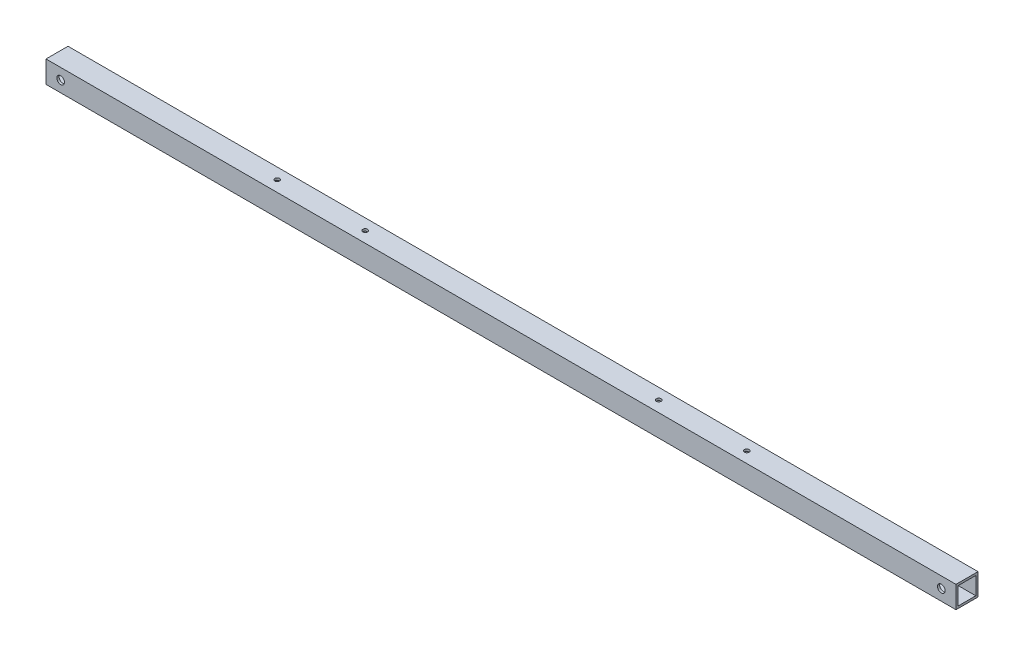
ISO-10303-21;
HEADER;
FILE_DESCRIPTION(('STEP AP214'),'2;1');
FILE_NAME('part.step','',(''),(''),'','','');
FILE_SCHEMA(('AUTOMOTIVE_DESIGN { 1 0 10303 214 1 1 1 1 }'));
ENDSEC;
DATA;
#1=APPLICATION_CONTEXT('core data for automotive mechanical design processes');
#2=APPLICATION_PROTOCOL_DEFINITION('international standard','automotive_design',2000,#1);
#3=PRODUCT_CONTEXT('',#1,'mechanical');
#4=PRODUCT('Part','Part','',(#3));
#5=PRODUCT_RELATED_PRODUCT_CATEGORY('part','',(#4));
#6=PRODUCT_DEFINITION_FORMATION('','',#4);
#7=PRODUCT_DEFINITION_CONTEXT('part definition',#1,'design');
#8=PRODUCT_DEFINITION('design','',#6,#7);
#9=PRODUCT_DEFINITION_SHAPE('','',#8);
#10=(LENGTH_UNIT() NAMED_UNIT(*) SI_UNIT(.MILLI.,.METRE.));
#11=(NAMED_UNIT(*) PLANE_ANGLE_UNIT() SI_UNIT($,.RADIAN.));
#12=(NAMED_UNIT(*) SI_UNIT($,.STERADIAN.) SOLID_ANGLE_UNIT());
#13=UNCERTAINTY_MEASURE_WITH_UNIT(LENGTH_MEASURE(1.E-05),#10,'distance_accuracy_value','');
#14=(GEOMETRIC_REPRESENTATION_CONTEXT(3) GLOBAL_UNCERTAINTY_ASSIGNED_CONTEXT((#13)) GLOBAL_UNIT_ASSIGNED_CONTEXT((#10,
#11,#12)) REPRESENTATION_CONTEXT('',''));
#15=CARTESIAN_POINT('',(0.,0.,0.));
#16=DIRECTION('',(0.,0.,1.));
#17=DIRECTION('',(1.,0.,0.));
#18=AXIS2_PLACEMENT_3D('',#15,#16,#17);
#19=CARTESIAN_POINT('',(10.,7.5,15.));
#20=DIRECTION('',(0.,0.,-1.));
#21=DIRECTION('',(-1.,0.,0.));
#22=AXIS2_PLACEMENT_3D('',#19,#20,#21);
#23=CYLINDRICAL_SURFACE('',#22,2.6);
#24=CARTESIAN_POINT('',(10.,7.5,13.5));
#25=DIRECTION('',(0.,0.,1.));
#26=DIRECTION('',(1.,0.,0.));
#27=AXIS2_PLACEMENT_3D('',#24,#25,#26);
#28=CIRCLE('',#27,2.6);
#29=CARTESIAN_POINT('',(12.6,7.5,13.5));
#30=VERTEX_POINT('',#29);
#31=EDGE_CURVE('E170',#30,#30,#28,.T.);
#32=ORIENTED_EDGE('',*,*,#31,.F.);
#33=EDGE_LOOP('',(#32));
#34=FACE_BOUND('',#33,.T.);
#35=CARTESIAN_POINT('',(10.,7.5,15.));
#36=DIRECTION('',(0.,0.,1.));
#37=DIRECTION('',(1.,0.,0.));
#38=AXIS2_PLACEMENT_3D('',#35,#36,#37);
#39=CIRCLE('',#38,2.6);
#40=CARTESIAN_POINT('',(12.6,7.5,15.));
#41=VERTEX_POINT('',#40);
#42=EDGE_CURVE('E183',#41,#41,#39,.T.);
#43=ORIENTED_EDGE('',*,*,#42,.T.);
#44=EDGE_LOOP('',(#43));
#45=FACE_BOUND('',#44,.T.);
#46=ADVANCED_FACE('F45',(#34,#45),#23,.F.);
#47=CARTESIAN_POINT('',(610.,7.5,15.));
#48=DIRECTION('',(0.,0.,-1.));
#49=DIRECTION('',(-1.,0.,0.));
#50=AXIS2_PLACEMENT_3D('',#47,#48,#49);
#51=CYLINDRICAL_SURFACE('',#50,2.60000000000007);
#52=CARTESIAN_POINT('',(610.,7.5,13.5));
#53=DIRECTION('',(0.,0.,1.));
#54=DIRECTION('',(1.,0.,0.));
#55=AXIS2_PLACEMENT_3D('',#52,#53,#54);
#56=CIRCLE('',#55,2.60000000000007);
#57=CARTESIAN_POINT('',(612.6,7.5,13.5));
#58=VERTEX_POINT('',#57);
#59=EDGE_CURVE('E169',#58,#58,#56,.T.);
#60=ORIENTED_EDGE('',*,*,#59,.F.);
#61=EDGE_LOOP('',(#60));
#62=FACE_BOUND('',#61,.T.);
#63=CARTESIAN_POINT('',(610.,7.5,15.));
#64=DIRECTION('',(0.,0.,1.));
#65=DIRECTION('',(1.,0.,0.));
#66=AXIS2_PLACEMENT_3D('',#63,#64,#65);
#67=CIRCLE('',#66,2.60000000000007);
#68=CARTESIAN_POINT('',(612.6,7.5,15.));
#69=VERTEX_POINT('',#68);
#70=EDGE_CURVE('E175',#69,#69,#67,.T.);
#71=ORIENTED_EDGE('',*,*,#70,.T.);
#72=EDGE_LOOP('',(#71));
#73=FACE_BOUND('',#72,.T.);
#74=ADVANCED_FACE('F322',(#62,#73),#51,.F.);
#75=CARTESIAN_POINT('',(0.,0.,15.));
#76=DIRECTION('',(0.,0.,-1.));
#77=DIRECTION('',(-1.,0.,0.));
#78=AXIS2_PLACEMENT_3D('',#75,#76,#77);
#79=PLANE('',#78);
#80=DIRECTION('',(0.,-1.,0.));
#81=VECTOR('',#80,1.);
#82=CARTESIAN_POINT('',(0.,0.,15.));
#83=LINE('',#82,#81);
#84=CARTESIAN_POINT('',(0.,15.,15.));
#85=VERTEX_POINT('',#84);
#86=CARTESIAN_POINT('',(0.,0.,15.));
#87=VERTEX_POINT('',#86);
#88=EDGE_CURVE('E191',#85,#87,#83,.T.);
#89=ORIENTED_EDGE('',*,*,#88,.T.);
#90=DIRECTION('',(1.,0.,0.));
#91=VECTOR('',#90,1.);
#92=CARTESIAN_POINT('',(0.,0.,15.));
#93=LINE('',#92,#91);
#94=CARTESIAN_POINT('',(620.,0.,15.));
#95=VERTEX_POINT('',#94);
#96=EDGE_CURVE('E195',#87,#95,#93,.T.);
#97=ORIENTED_EDGE('',*,*,#96,.T.);
#98=DIRECTION('',(0.,1.,0.));
#99=VECTOR('',#98,1.);
#100=CARTESIAN_POINT('',(620.,0.,15.));
#101=LINE('',#100,#99);
#102=CARTESIAN_POINT('',(620.,15.,15.));
#103=VERTEX_POINT('',#102);
#104=EDGE_CURVE('E199',#95,#103,#101,.T.);
#105=ORIENTED_EDGE('',*,*,#104,.T.);
#106=DIRECTION('',(-1.,0.,0.));
#107=VECTOR('',#106,1.);
#108=CARTESIAN_POINT('',(0.,15.,15.));
#109=LINE('',#108,#107);
#110=EDGE_CURVE('E202',#103,#85,#109,.T.);
#111=ORIENTED_EDGE('',*,*,#110,.T.);
#112=EDGE_LOOP('',(#89,#97,#105,#111));
#113=FACE_BOUND('',#112,.T.);
#114=ORIENTED_EDGE('',*,*,#42,.F.);
#115=EDGE_LOOP('',(#114));
#116=FACE_BOUND('',#115,.T.);
#117=ORIENTED_EDGE('',*,*,#70,.F.);
#118=EDGE_LOOP('',(#117));
#119=FACE_BOUND('',#118,.T.);
#120=ADVANCED_FACE('F330',(#113,#116,#119),#79,.F.);
#121=CARTESIAN_POINT('',(0.,0.,0.));
#122=DIRECTION('',(0.,0.,-1.));
#123=DIRECTION('',(-1.,0.,0.));
#124=AXIS2_PLACEMENT_3D('',#121,#122,#123);
#125=PLANE('',#124);
#126=CARTESIAN_POINT('',(10.,7.5,0.));
#127=DIRECTION('',(0.,0.,1.));
#128=DIRECTION('',(1.,0.,0.));
#129=AXIS2_PLACEMENT_3D('',#126,#127,#128);
#130=CIRCLE('',#129,2.6);
#131=CARTESIAN_POINT('',(12.6,7.5,0.));
#132=VERTEX_POINT('',#131);
#133=EDGE_CURVE('E179',#132,#132,#130,.T.);
#134=ORIENTED_EDGE('',*,*,#133,.T.);
#135=EDGE_LOOP('',(#134));
#136=FACE_BOUND('',#135,.T.);
#137=DIRECTION('',(0.,-1.,0.));
#138=VECTOR('',#137,1.);
#139=CARTESIAN_POINT('',(0.,0.,0.));
#140=LINE('',#139,#138);
#141=CARTESIAN_POINT('',(0.,15.,0.));
#142=VERTEX_POINT('',#141);
#143=CARTESIAN_POINT('',(0.,0.,0.));
#144=VERTEX_POINT('',#143);
#145=EDGE_CURVE('E187',#142,#144,#140,.T.);
#146=ORIENTED_EDGE('',*,*,#145,.F.);
#147=DIRECTION('',(-1.,0.,0.));
#148=VECTOR('',#147,1.);
#149=CARTESIAN_POINT('',(0.,15.,0.));
#150=LINE('',#149,#148);
#151=CARTESIAN_POINT('',(620.,15.,0.));
#152=VERTEX_POINT('',#151);
#153=EDGE_CURVE('E196',#152,#142,#150,.T.);
#154=ORIENTED_EDGE('',*,*,#153,.F.);
#155=DIRECTION('',(0.,1.,0.));
#156=VECTOR('',#155,1.);
#157=CARTESIAN_POINT('',(620.,0.,0.));
#158=LINE('',#157,#156);
#159=CARTESIAN_POINT('',(620.,0.,0.));
#160=VERTEX_POINT('',#159);
#161=EDGE_CURVE('E212',#160,#152,#158,.T.);
#162=ORIENTED_EDGE('',*,*,#161,.F.);
#163=DIRECTION('',(1.,0.,0.));
#164=VECTOR('',#163,1.);
#165=CARTESIAN_POINT('',(0.,0.,0.));
#166=LINE('',#165,#164);
#167=EDGE_CURVE('E209',#144,#160,#166,.T.);
#168=ORIENTED_EDGE('',*,*,#167,.F.);
#169=EDGE_LOOP('',(#146,#154,#162,#168));
#170=FACE_BOUND('',#169,.T.);
#171=CARTESIAN_POINT('',(610.,7.5,0.));
#172=DIRECTION('',(0.,0.,1.));
#173=DIRECTION('',(1.,0.,0.));
#174=AXIS2_PLACEMENT_3D('',#171,#172,#173);
#175=CIRCLE('',#174,2.60000000000007);
#176=CARTESIAN_POINT('',(612.6,7.5,0.));
#177=VERTEX_POINT('',#176);
#178=EDGE_CURVE('E174',#177,#177,#175,.T.);
#179=ORIENTED_EDGE('',*,*,#178,.T.);
#180=EDGE_LOOP('',(#179));
#181=FACE_BOUND('',#180,.T.);
#182=ADVANCED_FACE('F352',(#136,#170,#181),#125,.T.);
#183=CARTESIAN_POINT('',(0.,0.,15.));
#184=DIRECTION('',(1.,0.,0.));
#185=DIRECTION('',(0.,0.,-1.));
#186=AXIS2_PLACEMENT_3D('',#183,#184,#185);
#187=PLANE('',#186);
#188=DIRECTION('',(0.,-1.,0.));
#189=VECTOR('',#188,1.);
#190=CARTESIAN_POINT('',(0.,13.5,1.5));
#191=LINE('',#190,#189);
#192=CARTESIAN_POINT('',(0.,13.5,1.5));
#193=VERTEX_POINT('',#192);
#194=CARTESIAN_POINT('',(0.,1.5,1.5));
#195=VERTEX_POINT('',#194);
#196=EDGE_CURVE('E150',#193,#195,#191,.T.);
#197=ORIENTED_EDGE('',*,*,#196,.F.);
#198=DIRECTION('',(0.,0.,-1.));
#199=VECTOR('',#198,1.);
#200=CARTESIAN_POINT('',(0.,13.5,13.5));
#201=LINE('',#200,#199);
#202=CARTESIAN_POINT('',(0.,13.5,13.5));
#203=VERTEX_POINT('',#202);
#204=EDGE_CURVE('E63',#203,#193,#201,.T.);
#205=ORIENTED_EDGE('',*,*,#204,.F.);
#206=DIRECTION('',(0.,1.,0.));
#207=VECTOR('',#206,1.);
#208=CARTESIAN_POINT('',(0.,1.5,13.5));
#209=LINE('',#208,#207);
#210=CARTESIAN_POINT('',(0.,1.5,13.5));
#211=VERTEX_POINT('',#210);
#212=EDGE_CURVE('E134',#211,#203,#209,.T.);
#213=ORIENTED_EDGE('',*,*,#212,.F.);
#214=DIRECTION('',(0.,0.,1.));
#215=VECTOR('',#214,1.);
#216=CARTESIAN_POINT('',(0.,1.5,1.5));
#217=LINE('',#216,#215);
#218=EDGE_CURVE('E138',#195,#211,#217,.T.);
#219=ORIENTED_EDGE('',*,*,#218,.F.);
#220=EDGE_LOOP('',(#197,#205,#213,#219));
#221=FACE_BOUND('',#220,.T.);
#222=ORIENTED_EDGE('',*,*,#145,.T.);
#223=DIRECTION('',(0.,0.,-1.));
#224=VECTOR('',#223,1.);
#225=CARTESIAN_POINT('',(0.,0.,15.));
#226=LINE('',#225,#224);
#227=EDGE_CURVE('E11',#87,#144,#226,.T.);
#228=ORIENTED_EDGE('',*,*,#227,.F.);
#229=ORIENTED_EDGE('',*,*,#88,.F.);
#230=DIRECTION('',(0.,0.,-1.));
#231=VECTOR('',#230,1.);
#232=CARTESIAN_POINT('',(0.,15.,15.));
#233=LINE('',#232,#231);
#234=EDGE_CURVE('E205',#85,#142,#233,.T.);
#235=ORIENTED_EDGE('',*,*,#234,.T.);
#236=EDGE_LOOP('',(#222,#228,#229,#235));
#237=FACE_BOUND('',#236,.T.);
#238=ADVANCED_FACE('F47',(#221,#237),#187,.F.);
#239=CARTESIAN_POINT('',(0.,0.,15.));
#240=DIRECTION('',(0.,1.,0.));
#241=DIRECTION('',(0.,0.,1.));
#242=AXIS2_PLACEMENT_3D('',#239,#240,#241);
#243=PLANE('',#242);
#244=CARTESIAN_POINT('',(470.,0.,7.50000000000002));
#245=DIRECTION('',(0.,1.,0.));
#246=DIRECTION('',(0.,0.,1.));
#247=AXIS2_PLACEMENT_3D('',#244,#245,#246);
#248=CIRCLE('',#247,1.5999999999999);
#249=CARTESIAN_POINT('',(470.,0.,9.09999999999992));
#250=VERTEX_POINT('',#249);
#251=EDGE_CURVE('E238',#250,#250,#248,.T.);
#252=ORIENTED_EDGE('',*,*,#251,.T.);
#253=EDGE_LOOP('',(#252));
#254=FACE_BOUND('',#253,.T.);
#255=CARTESIAN_POINT('',(210.,0.,7.50000000000005));
#256=DIRECTION('',(0.,1.,0.));
#257=DIRECTION('',(0.,0.,1.));
#258=AXIS2_PLACEMENT_3D('',#255,#256,#257);
#259=CIRCLE('',#258,1.59999999999999);
#260=CARTESIAN_POINT('',(210.,0.,9.10000000000004));
#261=VERTEX_POINT('',#260);
#262=EDGE_CURVE('E278',#261,#261,#259,.T.);
#263=ORIENTED_EDGE('',*,*,#262,.T.);
#264=EDGE_LOOP('',(#263));
#265=FACE_BOUND('',#264,.T.);
#266=CARTESIAN_POINT('',(150.,0.,7.50000000000006));
#267=DIRECTION('',(0.,1.,0.));
#268=DIRECTION('',(0.,0.,1.));
#269=AXIS2_PLACEMENT_3D('',#266,#267,#268);
#270=CIRCLE('',#269,1.60000000000002);
#271=CARTESIAN_POINT('',(150.,0.,9.10000000000007));
#272=VERTEX_POINT('',#271);
#273=EDGE_CURVE('E260',#272,#272,#270,.T.);
#274=ORIENTED_EDGE('',*,*,#273,.T.);
#275=EDGE_LOOP('',(#274));
#276=FACE_BOUND('',#275,.T.);
#277=CARTESIAN_POINT('',(410.,0.,7.49999999999999));
#278=DIRECTION('',(0.,1.,0.));
#279=DIRECTION('',(0.,0.,1.));
#280=AXIS2_PLACEMENT_3D('',#277,#278,#279);
#281=CIRCLE('',#280,1.59999999999996);
#282=CARTESIAN_POINT('',(410.,0.,9.09999999999995));
#283=VERTEX_POINT('',#282);
#284=EDGE_CURVE('E269',#283,#283,#281,.T.);
#285=ORIENTED_EDGE('',*,*,#284,.T.);
#286=EDGE_LOOP('',(#285));
#287=FACE_BOUND('',#286,.T.);
#288=ORIENTED_EDGE('',*,*,#167,.T.);
#289=DIRECTION('',(0.,0.,-1.));
#290=VECTOR('',#289,1.);
#291=CARTESIAN_POINT('',(620.,0.,15.));
#292=LINE('',#291,#290);
#293=EDGE_CURVE('E55',#95,#160,#292,.T.);
#294=ORIENTED_EDGE('',*,*,#293,.F.);
#295=ORIENTED_EDGE('',*,*,#96,.F.);
#296=ORIENTED_EDGE('',*,*,#227,.T.);
#297=EDGE_LOOP('',(#288,#294,#295,#296));
#298=FACE_BOUND('',#297,.T.);
#299=ADVANCED_FACE('F292',(#254,#265,#276,#287,#298),#243,.F.);
#300=CARTESIAN_POINT('',(620.,0.,15.));
#301=DIRECTION('',(-1.,0.,0.));
#302=DIRECTION('',(0.,0.,1.));
#303=AXIS2_PLACEMENT_3D('',#300,#301,#302);
#304=PLANE('',#303);
#305=DIRECTION('',(0.,1.,0.));
#306=VECTOR('',#305,1.);
#307=CARTESIAN_POINT('',(620.,1.5,13.5));
#308=LINE('',#307,#306);
#309=CARTESIAN_POINT('',(620.,1.5,13.5));
#310=VERTEX_POINT('',#309);
#311=CARTESIAN_POINT('',(620.,13.5,13.5));
#312=VERTEX_POINT('',#311);
#313=EDGE_CURVE('E122',#310,#312,#308,.T.);
#314=ORIENTED_EDGE('',*,*,#313,.T.);
#315=DIRECTION('',(0.,0.,-1.));
#316=VECTOR('',#315,1.);
#317=CARTESIAN_POINT('',(620.,13.5,13.5));
#318=LINE('',#317,#316);
#319=CARTESIAN_POINT('',(620.,13.5,1.5));
#320=VERTEX_POINT('',#319);
#321=EDGE_CURVE('E115',#312,#320,#318,.T.);
#322=ORIENTED_EDGE('',*,*,#321,.T.);
#323=DIRECTION('',(0.,-1.,0.));
#324=VECTOR('',#323,1.);
#325=CARTESIAN_POINT('',(620.,13.5,1.5));
#326=LINE('',#325,#324);
#327=CARTESIAN_POINT('',(620.,1.5,1.5));
#328=VERTEX_POINT('',#327);
#329=EDGE_CURVE('E125',#320,#328,#326,.T.);
#330=ORIENTED_EDGE('',*,*,#329,.T.);
#331=DIRECTION('',(0.,0.,1.));
#332=VECTOR('',#331,1.);
#333=CARTESIAN_POINT('',(620.,1.5,1.5));
#334=LINE('',#333,#332);
#335=EDGE_CURVE('E71',#328,#310,#334,.T.);
#336=ORIENTED_EDGE('',*,*,#335,.T.);
#337=EDGE_LOOP('',(#314,#322,#330,#336));
#338=FACE_BOUND('',#337,.T.);
#339=ORIENTED_EDGE('',*,*,#161,.T.);
#340=DIRECTION('',(0.,0.,-1.));
#341=VECTOR('',#340,1.);
#342=CARTESIAN_POINT('',(620.,15.,15.));
#343=LINE('',#342,#341);
#344=EDGE_CURVE('E220',#103,#152,#343,.T.);
#345=ORIENTED_EDGE('',*,*,#344,.F.);
#346=ORIENTED_EDGE('',*,*,#104,.F.);
#347=ORIENTED_EDGE('',*,*,#293,.T.);
#348=EDGE_LOOP('',(#339,#345,#346,#347));
#349=FACE_BOUND('',#348,.T.);
#350=ADVANCED_FACE('F130',(#338,#349),#304,.F.);
#351=CARTESIAN_POINT('',(0.,15.,15.));
#352=DIRECTION('',(0.,-1.,0.));
#353=DIRECTION('',(0.,0.,-1.));
#354=AXIS2_PLACEMENT_3D('',#351,#352,#353);
#355=PLANE('',#354);
#356=CARTESIAN_POINT('',(470.,15.,7.50000000000002));
#357=DIRECTION('',(0.,1.,0.));
#358=DIRECTION('',(0.,0.,1.));
#359=AXIS2_PLACEMENT_3D('',#356,#357,#358);
#360=CIRCLE('',#359,1.5999999999999);
#361=CARTESIAN_POINT('',(470.,15.,9.09999999999992));
#362=VERTEX_POINT('',#361);
#363=EDGE_CURVE('E277',#362,#362,#360,.T.);
#364=ORIENTED_EDGE('',*,*,#363,.F.);
#365=EDGE_LOOP('',(#364));
#366=FACE_BOUND('',#365,.T.);
#367=CARTESIAN_POINT('',(210.,15.,7.50000000000005));
#368=DIRECTION('',(0.,1.,0.));
#369=DIRECTION('',(0.,0.,1.));
#370=AXIS2_PLACEMENT_3D('',#367,#368,#369);
#371=CIRCLE('',#370,1.59999999999999);
#372=CARTESIAN_POINT('',(210.,15.,9.10000000000004));
#373=VERTEX_POINT('',#372);
#374=EDGE_CURVE('E265',#373,#373,#371,.T.);
#375=ORIENTED_EDGE('',*,*,#374,.F.);
#376=EDGE_LOOP('',(#375));
#377=FACE_BOUND('',#376,.T.);
#378=CARTESIAN_POINT('',(150.,15.,7.50000000000006));
#379=DIRECTION('',(0.,1.,0.));
#380=DIRECTION('',(0.,0.,1.));
#381=AXIS2_PLACEMENT_3D('',#378,#379,#380);
#382=CIRCLE('',#381,1.60000000000002);
#383=CARTESIAN_POINT('',(150.,15.,9.10000000000007));
#384=VERTEX_POINT('',#383);
#385=EDGE_CURVE('E264',#384,#384,#382,.T.);
#386=ORIENTED_EDGE('',*,*,#385,.F.);
#387=EDGE_LOOP('',(#386));
#388=FACE_BOUND('',#387,.T.);
#389=CARTESIAN_POINT('',(410.,15.,7.49999999999999));
#390=DIRECTION('',(0.,1.,0.));
#391=DIRECTION('',(0.,0.,1.));
#392=AXIS2_PLACEMENT_3D('',#389,#390,#391);
#393=CIRCLE('',#392,1.59999999999996);
#394=CARTESIAN_POINT('',(410.,15.,9.09999999999995));
#395=VERTEX_POINT('',#394);
#396=EDGE_CURVE('E273',#395,#395,#393,.T.);
#397=ORIENTED_EDGE('',*,*,#396,.F.);
#398=EDGE_LOOP('',(#397));
#399=FACE_BOUND('',#398,.T.);
#400=ORIENTED_EDGE('',*,*,#153,.T.);
#401=ORIENTED_EDGE('',*,*,#234,.F.);
#402=ORIENTED_EDGE('',*,*,#110,.F.);
#403=ORIENTED_EDGE('',*,*,#344,.T.);
#404=EDGE_LOOP('',(#400,#401,#402,#403));
#405=FACE_BOUND('',#404,.T.);
#406=ADVANCED_FACE('F338',(#366,#377,#388,#399,#405),#355,.F.);
#407=CARTESIAN_POINT('',(10.,7.5,1.5));
#408=DIRECTION('',(0.,0.,-1.));
#409=DIRECTION('',(-1.,0.,0.));
#410=AXIS2_PLACEMENT_3D('',#407,#408,#409);
#411=CIRCLE('',#410,2.6);
#412=CARTESIAN_POINT('',(7.4,7.5,1.5));
#413=VERTEX_POINT('',#412);
#414=EDGE_CURVE('E165',#413,#413,#411,.T.);
#415=ORIENTED_EDGE('',*,*,#414,.F.);
#416=EDGE_LOOP('',(#415));
#417=FACE_BOUND('',#416,.T.);
#418=ORIENTED_EDGE('',*,*,#133,.F.);
#419=EDGE_LOOP('',(#418));
#420=FACE_BOUND('',#419,.T.);
#421=ADVANCED_FACE('F325',(#417,#420),#23,.F.);
#422=CARTESIAN_POINT('',(610.,7.5,1.5));
#423=DIRECTION('',(0.,0.,-1.));
#424=DIRECTION('',(-1.,0.,0.));
#425=AXIS2_PLACEMENT_3D('',#422,#423,#424);
#426=CIRCLE('',#425,2.60000000000007);
#427=CARTESIAN_POINT('',(607.4,7.5,1.5));
#428=VERTEX_POINT('',#427);
#429=EDGE_CURVE('E159',#428,#428,#426,.T.);
#430=ORIENTED_EDGE('',*,*,#429,.F.);
#431=EDGE_LOOP('',(#430));
#432=FACE_BOUND('',#431,.T.);
#433=ORIENTED_EDGE('',*,*,#178,.F.);
#434=EDGE_LOOP('',(#433));
#435=FACE_BOUND('',#434,.T.);
#436=ADVANCED_FACE('F333',(#432,#435),#51,.F.);
#437=CARTESIAN_POINT('',(620.,13.5,13.5));
#438=DIRECTION('',(0.,1.,0.));
#439=DIRECTION('',(0.,0.,1.));
#440=AXIS2_PLACEMENT_3D('',#437,#438,#439);
#441=PLANE('',#440);
#442=CARTESIAN_POINT('',(470.,13.5,7.50000000000002));
#443=DIRECTION('',(0.,1.,0.));
#444=DIRECTION('',(0.,0.,1.));
#445=AXIS2_PLACEMENT_3D('',#442,#443,#444);
#446=CIRCLE('',#445,1.5999999999999);
#447=CARTESIAN_POINT('',(470.,13.5,9.09999999999992));
#448=VERTEX_POINT('',#447);
#449=EDGE_CURVE('E141',#448,#448,#446,.T.);
#450=ORIENTED_EDGE('',*,*,#449,.T.);
#451=EDGE_LOOP('',(#450));
#452=FACE_BOUND('',#451,.T.);
#453=CARTESIAN_POINT('',(210.,13.5,7.50000000000005));
#454=DIRECTION('',(0.,1.,0.));
#455=DIRECTION('',(0.,0.,1.));
#456=AXIS2_PLACEMENT_3D('',#453,#454,#455);
#457=CIRCLE('',#456,1.59999999999999);
#458=CARTESIAN_POINT('',(210.,13.5,9.10000000000004));
#459=VERTEX_POINT('',#458);
#460=EDGE_CURVE('E246',#459,#459,#457,.T.);
#461=ORIENTED_EDGE('',*,*,#460,.T.);
#462=EDGE_LOOP('',(#461));
#463=FACE_BOUND('',#462,.T.);
#464=CARTESIAN_POINT('',(150.,13.5,7.50000000000006));
#465=DIRECTION('',(0.,1.,0.));
#466=DIRECTION('',(0.,0.,1.));
#467=AXIS2_PLACEMENT_3D('',#464,#465,#466);
#468=CIRCLE('',#467,1.60000000000002);
#469=CARTESIAN_POINT('',(150.,13.5,9.10000000000007));
#470=VERTEX_POINT('',#469);
#471=EDGE_CURVE('E242',#470,#470,#468,.T.);
#472=ORIENTED_EDGE('',*,*,#471,.T.);
#473=EDGE_LOOP('',(#472));
#474=FACE_BOUND('',#473,.T.);
#475=CARTESIAN_POINT('',(410.,13.5,7.49999999999999));
#476=DIRECTION('',(0.,1.,0.));
#477=DIRECTION('',(0.,0.,1.));
#478=AXIS2_PLACEMENT_3D('',#475,#476,#477);
#479=CIRCLE('',#478,1.59999999999996);
#480=CARTESIAN_POINT('',(410.,13.5,9.09999999999995));
#481=VERTEX_POINT('',#480);
#482=EDGE_CURVE('E237',#481,#481,#479,.T.);
#483=ORIENTED_EDGE('',*,*,#482,.T.);
#484=EDGE_LOOP('',(#483));
#485=FACE_BOUND('',#484,.T.);
#486=ORIENTED_EDGE('',*,*,#204,.T.);
#487=DIRECTION('',(-1.,0.,0.));
#488=VECTOR('',#487,1.);
#489=CARTESIAN_POINT('',(620.,13.5,1.5));
#490=LINE('',#489,#488);
#491=EDGE_CURVE('E111',#320,#193,#490,.T.);
#492=ORIENTED_EDGE('',*,*,#491,.F.);
#493=ORIENTED_EDGE('',*,*,#321,.F.);
#494=DIRECTION('',(-1.,0.,0.));
#495=VECTOR('',#494,1.);
#496=CARTESIAN_POINT('',(620.,13.5,13.5));
#497=LINE('',#496,#495);
#498=EDGE_CURVE('E156',#312,#203,#497,.T.);
#499=ORIENTED_EDGE('',*,*,#498,.T.);
#500=EDGE_LOOP('',(#486,#492,#493,#499));
#501=FACE_BOUND('',#500,.T.);
#502=ADVANCED_FACE('F113',(#452,#463,#474,#485,#501),#441,.F.);
#503=CARTESIAN_POINT('',(620.,1.5,13.5));
#504=DIRECTION('',(0.,0.,1.));
#505=DIRECTION('',(1.,0.,0.));
#506=AXIS2_PLACEMENT_3D('',#503,#504,#505);
#507=PLANE('',#506);
#508=ORIENTED_EDGE('',*,*,#31,.T.);
#509=EDGE_LOOP('',(#508));
#510=FACE_BOUND('',#509,.T.);
#511=ORIENTED_EDGE('',*,*,#59,.T.);
#512=EDGE_LOOP('',(#511));
#513=FACE_BOUND('',#512,.T.);
#514=ORIENTED_EDGE('',*,*,#212,.T.);
#515=ORIENTED_EDGE('',*,*,#498,.F.);
#516=ORIENTED_EDGE('',*,*,#313,.F.);
#517=DIRECTION('',(-1.,0.,0.));
#518=VECTOR('',#517,1.);
#519=CARTESIAN_POINT('',(620.,1.5,13.5));
#520=LINE('',#519,#518);
#521=EDGE_CURVE('E160',#310,#211,#520,.T.);
#522=ORIENTED_EDGE('',*,*,#521,.T.);
#523=EDGE_LOOP('',(#514,#515,#516,#522));
#524=FACE_BOUND('',#523,.T.);
#525=ADVANCED_FACE('F393',(#510,#513,#524),#507,.F.);
#526=CARTESIAN_POINT('',(620.,1.5,1.5));
#527=DIRECTION('',(0.,-1.,0.));
#528=DIRECTION('',(0.,0.,-1.));
#529=AXIS2_PLACEMENT_3D('',#526,#527,#528);
#530=PLANE('',#529);
#531=CARTESIAN_POINT('',(470.,1.5,7.50000000000002));
#532=DIRECTION('',(0.,-1.,0.));
#533=DIRECTION('',(0.,0.,-1.));
#534=AXIS2_PLACEMENT_3D('',#531,#532,#533);
#535=CIRCLE('',#534,1.5999999999999);
#536=CARTESIAN_POINT('',(470.,1.5,5.90000000000012));
#537=VERTEX_POINT('',#536);
#538=EDGE_CURVE('E49',#537,#537,#535,.T.);
#539=ORIENTED_EDGE('',*,*,#538,.T.);
#540=EDGE_LOOP('',(#539));
#541=FACE_BOUND('',#540,.T.);
#542=CARTESIAN_POINT('',(210.,1.5,7.50000000000005));
#543=DIRECTION('',(0.,-1.,0.));
#544=DIRECTION('',(0.,0.,-1.));
#545=AXIS2_PLACEMENT_3D('',#542,#543,#544);
#546=CIRCLE('',#545,1.59999999999999);
#547=CARTESIAN_POINT('',(210.,1.5,5.90000000000006));
#548=VERTEX_POINT('',#547);
#549=EDGE_CURVE('E243',#548,#548,#546,.T.);
#550=ORIENTED_EDGE('',*,*,#549,.T.);
#551=EDGE_LOOP('',(#550));
#552=FACE_BOUND('',#551,.T.);
#553=CARTESIAN_POINT('',(150.,1.5,7.50000000000006));
#554=DIRECTION('',(0.,-1.,0.));
#555=DIRECTION('',(0.,0.,-1.));
#556=AXIS2_PLACEMENT_3D('',#553,#554,#555);
#557=CIRCLE('',#556,1.60000000000002);
#558=CARTESIAN_POINT('',(150.,1.5,5.90000000000004));
#559=VERTEX_POINT('',#558);
#560=EDGE_CURVE('E239',#559,#559,#557,.T.);
#561=ORIENTED_EDGE('',*,*,#560,.T.);
#562=EDGE_LOOP('',(#561));
#563=FACE_BOUND('',#562,.T.);
#564=CARTESIAN_POINT('',(410.,1.5,7.49999999999999));
#565=DIRECTION('',(0.,-1.,0.));
#566=DIRECTION('',(0.,0.,-1.));
#567=AXIS2_PLACEMENT_3D('',#564,#565,#566);
#568=CIRCLE('',#567,1.59999999999996);
#569=CARTESIAN_POINT('',(410.,1.5,5.90000000000002));
#570=VERTEX_POINT('',#569);
#571=EDGE_CURVE('E233',#570,#570,#568,.T.);
#572=ORIENTED_EDGE('',*,*,#571,.T.);
#573=EDGE_LOOP('',(#572));
#574=FACE_BOUND('',#573,.T.);
#575=ORIENTED_EDGE('',*,*,#218,.T.);
#576=ORIENTED_EDGE('',*,*,#521,.F.);
#577=ORIENTED_EDGE('',*,*,#335,.F.);
#578=DIRECTION('',(-1.,0.,0.));
#579=VECTOR('',#578,1.);
#580=CARTESIAN_POINT('',(620.,1.5,1.5));
#581=LINE('',#580,#579);
#582=EDGE_CURVE('E121',#328,#195,#581,.T.);
#583=ORIENTED_EDGE('',*,*,#582,.T.);
#584=EDGE_LOOP('',(#575,#576,#577,#583));
#585=FACE_BOUND('',#584,.T.);
#586=ADVANCED_FACE('F391',(#541,#552,#563,#574,#585),#530,.F.);
#587=CARTESIAN_POINT('',(620.,13.5,1.5));
#588=DIRECTION('',(0.,0.,-1.));
#589=DIRECTION('',(-1.,0.,0.));
#590=AXIS2_PLACEMENT_3D('',#587,#588,#589);
#591=PLANE('',#590);
#592=ORIENTED_EDGE('',*,*,#414,.T.);
#593=EDGE_LOOP('',(#592));
#594=FACE_BOUND('',#593,.T.);
#595=ORIENTED_EDGE('',*,*,#429,.T.);
#596=EDGE_LOOP('',(#595));
#597=FACE_BOUND('',#596,.T.);
#598=ORIENTED_EDGE('',*,*,#196,.T.);
#599=ORIENTED_EDGE('',*,*,#582,.F.);
#600=ORIENTED_EDGE('',*,*,#329,.F.);
#601=ORIENTED_EDGE('',*,*,#491,.T.);
#602=EDGE_LOOP('',(#598,#599,#600,#601));
#603=FACE_BOUND('',#602,.T.);
#604=ADVANCED_FACE('F126',(#594,#597,#603),#591,.F.);
#605=CARTESIAN_POINT('',(410.,0.,7.49999999999999));
#606=DIRECTION('',(0.,1.,0.));
#607=DIRECTION('',(0.,0.,1.));
#608=AXIS2_PLACEMENT_3D('',#605,#606,#607);
#609=CYLINDRICAL_SURFACE('',#608,1.59999999999996);
#610=ORIENTED_EDGE('',*,*,#284,.F.);
#611=EDGE_LOOP('',(#610));
#612=FACE_BOUND('',#611,.T.);
#613=ORIENTED_EDGE('',*,*,#571,.F.);
#614=EDGE_LOOP('',(#613));
#615=FACE_BOUND('',#614,.T.);
#616=ADVANCED_FACE('F407',(#612,#615),#609,.F.);
#617=CARTESIAN_POINT('',(150.,0.,7.50000000000006));
#618=DIRECTION('',(0.,1.,0.));
#619=DIRECTION('',(0.,0.,1.));
#620=AXIS2_PLACEMENT_3D('',#617,#618,#619);
#621=CYLINDRICAL_SURFACE('',#620,1.60000000000002);
#622=ORIENTED_EDGE('',*,*,#273,.F.);
#623=EDGE_LOOP('',(#622));
#624=FACE_BOUND('',#623,.T.);
#625=ORIENTED_EDGE('',*,*,#560,.F.);
#626=EDGE_LOOP('',(#625));
#627=FACE_BOUND('',#626,.T.);
#628=ADVANCED_FACE('F412',(#624,#627),#621,.F.);
#629=CARTESIAN_POINT('',(210.,0.,7.50000000000005));
#630=DIRECTION('',(0.,1.,0.));
#631=DIRECTION('',(0.,0.,1.));
#632=AXIS2_PLACEMENT_3D('',#629,#630,#631);
#633=CYLINDRICAL_SURFACE('',#632,1.59999999999999);
#634=ORIENTED_EDGE('',*,*,#262,.F.);
#635=EDGE_LOOP('',(#634));
#636=FACE_BOUND('',#635,.T.);
#637=ORIENTED_EDGE('',*,*,#549,.F.);
#638=EDGE_LOOP('',(#637));
#639=FACE_BOUND('',#638,.T.);
#640=ADVANCED_FACE('F299',(#636,#639),#633,.F.);
#641=CARTESIAN_POINT('',(470.,0.,7.50000000000002));
#642=DIRECTION('',(0.,1.,0.));
#643=DIRECTION('',(0.,0.,1.));
#644=AXIS2_PLACEMENT_3D('',#641,#642,#643);
#645=CYLINDRICAL_SURFACE('',#644,1.5999999999999);
#646=ORIENTED_EDGE('',*,*,#251,.F.);
#647=EDGE_LOOP('',(#646));
#648=FACE_BOUND('',#647,.T.);
#649=ORIENTED_EDGE('',*,*,#538,.F.);
#650=EDGE_LOOP('',(#649));
#651=FACE_BOUND('',#650,.T.);
#652=ADVANCED_FACE('F295',(#648,#651),#645,.F.);
#653=ORIENTED_EDGE('',*,*,#396,.T.);
#654=EDGE_LOOP('',(#653));
#655=FACE_BOUND('',#654,.T.);
#656=ORIENTED_EDGE('',*,*,#482,.F.);
#657=EDGE_LOOP('',(#656));
#658=FACE_BOUND('',#657,.T.);
#659=ADVANCED_FACE('F298',(#655,#658),#609,.F.);
#660=ORIENTED_EDGE('',*,*,#385,.T.);
#661=EDGE_LOOP('',(#660));
#662=FACE_BOUND('',#661,.T.);
#663=ORIENTED_EDGE('',*,*,#471,.F.);
#664=EDGE_LOOP('',(#663));
#665=FACE_BOUND('',#664,.T.);
#666=ADVANCED_FACE('F318',(#662,#665),#621,.F.);
#667=ORIENTED_EDGE('',*,*,#374,.T.);
#668=EDGE_LOOP('',(#667));
#669=FACE_BOUND('',#668,.T.);
#670=ORIENTED_EDGE('',*,*,#460,.F.);
#671=EDGE_LOOP('',(#670));
#672=FACE_BOUND('',#671,.T.);
#673=ADVANCED_FACE('F313',(#669,#672),#633,.F.);
#674=ORIENTED_EDGE('',*,*,#363,.T.);
#675=EDGE_LOOP('',(#674));
#676=FACE_BOUND('',#675,.T.);
#677=ORIENTED_EDGE('',*,*,#449,.F.);
#678=EDGE_LOOP('',(#677));
#679=FACE_BOUND('',#678,.T.);
#680=ADVANCED_FACE('F301',(#676,#679),#645,.F.);
#681=CLOSED_SHELL('',(#46,#74,#120,#182,#238,#299,#350,#406,#421,#436,#502,#525,#586,#604,#616,
#628,#640,#652,#659,#666,#673,#680));
#682=MANIFOLD_SOLID_BREP('B2',#681);
#683=ADVANCED_BREP_SHAPE_REPRESENTATION('',(#18,#682),#14);
#684=SHAPE_DEFINITION_REPRESENTATION(#9,#683);
ENDSEC;
END-ISO-10303-21;
